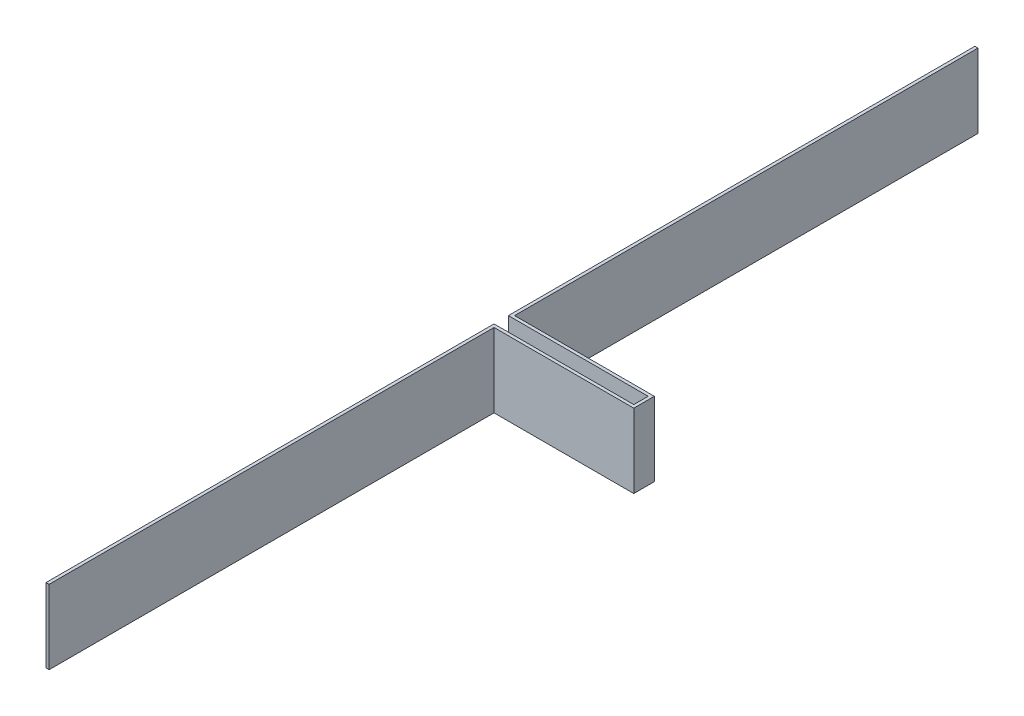
ISO-10303-21;
HEADER;
FILE_DESCRIPTION(('STEP AP214'),'2;1');
FILE_NAME('part.step','',(''),(''),'','','');
FILE_SCHEMA(('AUTOMOTIVE_DESIGN { 1 0 10303 214 1 1 1 1 }'));
ENDSEC;
DATA;
#1=APPLICATION_CONTEXT('core data for automotive mechanical design processes');
#2=APPLICATION_PROTOCOL_DEFINITION('international standard','automotive_design',2000,#1);
#3=PRODUCT_CONTEXT('',#1,'mechanical');
#4=PRODUCT('Part','Part','',(#3));
#5=PRODUCT_RELATED_PRODUCT_CATEGORY('part','',(#4));
#6=PRODUCT_DEFINITION_FORMATION('','',#4);
#7=PRODUCT_DEFINITION_CONTEXT('part definition',#1,'design');
#8=PRODUCT_DEFINITION('design','',#6,#7);
#9=PRODUCT_DEFINITION_SHAPE('','',#8);
#10=(LENGTH_UNIT() NAMED_UNIT(*) SI_UNIT(.MILLI.,.METRE.));
#11=(NAMED_UNIT(*) PLANE_ANGLE_UNIT() SI_UNIT($,.RADIAN.));
#12=(NAMED_UNIT(*) SI_UNIT($,.STERADIAN.) SOLID_ANGLE_UNIT());
#13=UNCERTAINTY_MEASURE_WITH_UNIT(LENGTH_MEASURE(1.E-05),#10,'distance_accuracy_value','');
#14=(GEOMETRIC_REPRESENTATION_CONTEXT(3) GLOBAL_UNCERTAINTY_ASSIGNED_CONTEXT((#13)) GLOBAL_UNIT_ASSIGNED_CONTEXT((#10,
#11,#12)) REPRESENTATION_CONTEXT('',''));
#15=CARTESIAN_POINT('',(0.,0.,0.));
#16=DIRECTION('',(0.,0.,1.));
#17=DIRECTION('',(1.,0.,0.));
#18=AXIS2_PLACEMENT_3D('',#15,#16,#17);
#19=CARTESIAN_POINT('',(19.05,457.200000000001,0.));
#20=DIRECTION('',(0.,0.,-1.00000000000001));
#21=DIRECTION('',(-1.,0.,0.));
#22=AXIS2_PLACEMENT_3D('',#19,#20,#21);
#23=PLANE('',#22);
#24=DIRECTION('',(1.,0.,0.));
#25=VECTOR('',#24,1.);
#26=CARTESIAN_POINT('',(19.05,0.,0.));
#27=LINE('',#26,#25);
#28=CARTESIAN_POINT('',(0.,0.,0.));
#29=VERTEX_POINT('',#28);
#30=CARTESIAN_POINT('',(19.05,0.,0.));
#31=VERTEX_POINT('',#30);
#32=EDGE_CURVE('E169',#29,#31,#27,.T.);
#33=ORIENTED_EDGE('',*,*,#32,.T.);
#34=DIRECTION('',(0.,-1.,0.));
#35=VECTOR('',#34,1.);
#36=CARTESIAN_POINT('',(19.05,457.200000000001,0.));
#37=LINE('',#36,#35);
#38=CARTESIAN_POINT('',(19.05,457.200000000001,0.));
#39=VERTEX_POINT('',#38);
#40=EDGE_CURVE('E11',#39,#31,#37,.T.);
#41=ORIENTED_EDGE('',*,*,#40,.F.);
#42=DIRECTION('',(1.,0.,0.));
#43=VECTOR('',#42,1.);
#44=CARTESIAN_POINT('',(19.05,457.200000000001,0.));
#45=LINE('',#44,#43);
#46=CARTESIAN_POINT('',(0.,457.200000000001,0.));
#47=VERTEX_POINT('',#46);
#48=EDGE_CURVE('E203',#47,#39,#45,.T.);
#49=ORIENTED_EDGE('',*,*,#48,.F.);
#50=DIRECTION('',(0.,-1.,0.));
#51=VECTOR('',#50,1.);
#52=CARTESIAN_POINT('',(0.,457.200000000001,0.));
#53=LINE('',#52,#51);
#54=EDGE_CURVE('E165',#47,#29,#53,.T.);
#55=ORIENTED_EDGE('',*,*,#54,.T.);
#56=EDGE_LOOP('',(#33,#41,#49,#55));
#57=FACE_BOUND('',#56,.T.);
#58=ADVANCED_FACE('F43',(#57),#23,.F.);
#59=CARTESIAN_POINT('',(19.0500000000002,457.200000000012,-2749.55000000002));
#60=DIRECTION('',(-1.,0.,0.));
#61=DIRECTION('',(0.,0.,1.00000000000001));
#62=AXIS2_PLACEMENT_3D('',#59,#60,#61);
#63=PLANE('',#62);
#64=DIRECTION('',(0.,0.,-1.00000000000001));
#65=VECTOR('',#64,1.);
#66=CARTESIAN_POINT('',(19.0500000000007,1.11022302462516E-11,-2749.55000000002));
#67=LINE('',#66,#65);
#68=CARTESIAN_POINT('',(19.0500000000007,1.11022302462516E-11,-2749.55000000002));
#69=VERTEX_POINT('',#68);
#70=EDGE_CURVE('E173',#31,#69,#67,.T.);
#71=ORIENTED_EDGE('',*,*,#70,.T.);
#72=DIRECTION('',(0.,-1.,0.));
#73=VECTOR('',#72,1.);
#74=CARTESIAN_POINT('',(19.0500000000002,457.200000000012,-2749.55000000002));
#75=LINE('',#74,#73);
#76=CARTESIAN_POINT('',(19.0500000000002,457.200000000012,-2749.55000000002));
#77=VERTEX_POINT('',#76);
#78=EDGE_CURVE('E52',#77,#69,#75,.T.);
#79=ORIENTED_EDGE('',*,*,#78,.F.);
#80=DIRECTION('',(0.,0.,-1.00000000000001));
#81=VECTOR('',#80,1.);
#82=CARTESIAN_POINT('',(19.0500000000002,457.200000000012,-2749.55000000002));
#83=LINE('',#82,#81);
#84=EDGE_CURVE('E115',#39,#77,#83,.T.);
#85=ORIENTED_EDGE('',*,*,#84,.F.);
#86=ORIENTED_EDGE('',*,*,#40,.T.);
#87=EDGE_LOOP('',(#71,#79,#85,#86));
#88=FACE_BOUND('',#87,.T.);
#89=ADVANCED_FACE('F325',(#88),#63,.F.);
#90=CARTESIAN_POINT('',(882.649999999999,457.200000000012,-2749.55000000002));
#91=DIRECTION('',(0.,0.,-1.00000000000001));
#92=DIRECTION('',(-1.,0.,0.));
#93=AXIS2_PLACEMENT_3D('',#90,#91,#92);
#94=PLANE('',#93);
#95=DIRECTION('',(1.,0.,0.));
#96=VECTOR('',#95,1.);
#97=CARTESIAN_POINT('',(882.649999999997,1.11022302462516E-11,-2749.55000000002));
#98=LINE('',#97,#96);
#99=CARTESIAN_POINT('',(882.649999999997,1.11022302462516E-11,-2749.55000000002));
#100=VERTEX_POINT('',#99);
#101=EDGE_CURVE('E176',#69,#100,#98,.T.);
#102=ORIENTED_EDGE('',*,*,#101,.T.);
#103=DIRECTION('',(0.,-1.,0.));
#104=VECTOR('',#103,1.);
#105=CARTESIAN_POINT('',(882.649999999999,457.200000000012,-2749.55000000002));
#106=LINE('',#105,#104);
#107=CARTESIAN_POINT('',(882.649999999999,457.200000000012,-2749.55000000002));
#108=VERTEX_POINT('',#107);
#109=EDGE_CURVE('E230',#108,#100,#106,.T.);
#110=ORIENTED_EDGE('',*,*,#109,.F.);
#111=DIRECTION('',(1.,0.,0.));
#112=VECTOR('',#111,1.);
#113=CARTESIAN_POINT('',(882.649999999999,457.200000000012,-2749.55000000002));
#114=LINE('',#113,#112);
#115=EDGE_CURVE('E241',#77,#108,#114,.T.);
#116=ORIENTED_EDGE('',*,*,#115,.F.);
#117=ORIENTED_EDGE('',*,*,#78,.T.);
#118=EDGE_LOOP('',(#102,#110,#116,#117));
#119=FACE_BOUND('',#118,.T.);
#120=ADVANCED_FACE('F239',(#119),#94,.F.);
#121=CARTESIAN_POINT('',(882.649999999997,457.200000000014,-2876.55000000002));
#122=DIRECTION('',(-1.,0.,0.));
#123=DIRECTION('',(0.,0.,1.00000000000001));
#124=AXIS2_PLACEMENT_3D('',#121,#122,#123);
#125=PLANE('',#124);
#126=DIRECTION('',(0.,0.,-1.00000000000001));
#127=VECTOR('',#126,1.);
#128=CARTESIAN_POINT('',(882.649999999997,1.11022302462516E-11,-2876.55000000002));
#129=LINE('',#128,#127);
#130=CARTESIAN_POINT('',(882.649999999997,1.11022302462516E-11,-2876.55000000002));
#131=VERTEX_POINT('',#130);
#132=EDGE_CURVE('E179',#100,#131,#129,.T.);
#133=ORIENTED_EDGE('',*,*,#132,.T.);
#134=DIRECTION('',(0.,-1.,0.));
#135=VECTOR('',#134,1.);
#136=CARTESIAN_POINT('',(882.649999999997,457.200000000014,-2876.55000000002));
#137=LINE('',#136,#135);
#138=CARTESIAN_POINT('',(882.649999999997,457.200000000014,-2876.55000000002));
#139=VERTEX_POINT('',#138);
#140=EDGE_CURVE('E226',#139,#131,#137,.T.);
#141=ORIENTED_EDGE('',*,*,#140,.F.);
#142=DIRECTION('',(0.,0.,-1.00000000000001));
#143=VECTOR('',#142,1.);
#144=CARTESIAN_POINT('',(882.649999999997,457.200000000014,-2876.55000000002));
#145=LINE('',#144,#143);
#146=EDGE_CURVE('E260',#108,#139,#145,.T.);
#147=ORIENTED_EDGE('',*,*,#146,.F.);
#148=ORIENTED_EDGE('',*,*,#109,.T.);
#149=EDGE_LOOP('',(#133,#141,#147,#148));
#150=FACE_BOUND('',#149,.T.);
#151=ADVANCED_FACE('F250',(#150),#125,.F.);
#152=CARTESIAN_POINT('',(19.0500000000007,457.200000000014,-2876.55000000002));
#153=DIRECTION('',(0.,0.,1.00000000000001));
#154=DIRECTION('',(1.,0.,0.));
#155=AXIS2_PLACEMENT_3D('',#152,#153,#154);
#156=PLANE('',#155);
#157=DIRECTION('',(-1.,0.,0.));
#158=VECTOR('',#157,1.);
#159=CARTESIAN_POINT('',(19.0500000000007,1.33226762955019E-11,-2876.55000000002));
#160=LINE('',#159,#158);
#161=CARTESIAN_POINT('',(19.0500000000007,1.33226762955019E-11,-2876.55000000002));
#162=VERTEX_POINT('',#161);
#163=EDGE_CURVE('E182',#131,#162,#160,.T.);
#164=ORIENTED_EDGE('',*,*,#163,.T.);
#165=DIRECTION('',(0.,-1.,0.));
#166=VECTOR('',#165,1.);
#167=CARTESIAN_POINT('',(19.0500000000007,457.200000000014,-2876.55000000002));
#168=LINE('',#167,#166);
#169=CARTESIAN_POINT('',(19.0500000000007,457.200000000014,-2876.55000000002));
#170=VERTEX_POINT('',#169);
#171=EDGE_CURVE('E222',#170,#162,#168,.T.);
#172=ORIENTED_EDGE('',*,*,#171,.F.);
#173=DIRECTION('',(-1.,0.,0.));
#174=VECTOR('',#173,1.);
#175=CARTESIAN_POINT('',(19.0500000000007,457.200000000014,-2876.55000000002));
#176=LINE('',#175,#174);
#177=EDGE_CURVE('E256',#139,#170,#176,.T.);
#178=ORIENTED_EDGE('',*,*,#177,.F.);
#179=ORIENTED_EDGE('',*,*,#140,.T.);
#180=EDGE_LOOP('',(#164,#172,#178,#179));
#181=FACE_BOUND('',#180,.T.);
#182=ADVANCED_FACE('F254',(#181),#156,.F.);
#183=CARTESIAN_POINT('',(19.0499999999973,457.200000000026,-5740.40000000004));
#184=DIRECTION('',(-1.,0.,0.));
#185=DIRECTION('',(0.,0.,1.00000000000001));
#186=AXIS2_PLACEMENT_3D('',#183,#184,#185);
#187=PLANE('',#186);
#188=DIRECTION('',(0.,0.,-1.00000000000001));
#189=VECTOR('',#188,1.);
#190=CARTESIAN_POINT('',(19.0499999999973,2.44249065417534E-11,-5740.40000000004));
#191=LINE('',#190,#189);
#192=CARTESIAN_POINT('',(19.0499999999973,2.44249065417534E-11,-5740.40000000004));
#193=VERTEX_POINT('',#192);
#194=EDGE_CURVE('E185',#162,#193,#191,.T.);
#195=ORIENTED_EDGE('',*,*,#194,.T.);
#196=DIRECTION('',(0.,-1.,0.));
#197=VECTOR('',#196,1.);
#198=CARTESIAN_POINT('',(19.0499999999973,457.200000000026,-5740.40000000004));
#199=LINE('',#198,#197);
#200=CARTESIAN_POINT('',(19.0499999999973,457.200000000026,-5740.40000000004));
#201=VERTEX_POINT('',#200);
#202=EDGE_CURVE('E218',#201,#193,#199,.T.);
#203=ORIENTED_EDGE('',*,*,#202,.F.);
#204=DIRECTION('',(0.,0.,-1.00000000000001));
#205=VECTOR('',#204,1.);
#206=CARTESIAN_POINT('',(19.0499999999973,457.200000000026,-5740.40000000004));
#207=LINE('',#206,#205);
#208=EDGE_CURVE('E259',#170,#201,#207,.T.);
#209=ORIENTED_EDGE('',*,*,#208,.F.);
#210=ORIENTED_EDGE('',*,*,#171,.T.);
#211=EDGE_LOOP('',(#195,#203,#209,#210));
#212=FACE_BOUND('',#211,.T.);
#213=ADVANCED_FACE('F337',(#212),#187,.F.);
#214=CARTESIAN_POINT('',(-2.66453525910038E-12,457.200000000026,-5740.40000000004));
#215=DIRECTION('',(0.,0.,1.00000000000001));
#216=DIRECTION('',(1.,0.,0.));
#217=AXIS2_PLACEMENT_3D('',#214,#215,#216);
#218=PLANE('',#217);
#219=DIRECTION('',(-1.,0.,0.));
#220=VECTOR('',#219,1.);
#221=CARTESIAN_POINT('',(-2.66453525910038E-12,2.44249065417534E-11,-5740.40000000004));
#222=LINE('',#221,#220);
#223=CARTESIAN_POINT('',(-2.66453525910038E-12,2.44249065417534E-11,-5740.40000000004));
#224=VERTEX_POINT('',#223);
#225=EDGE_CURVE('E188',#193,#224,#222,.T.);
#226=ORIENTED_EDGE('',*,*,#225,.T.);
#227=DIRECTION('',(0.,-1.,0.));
#228=VECTOR('',#227,1.);
#229=CARTESIAN_POINT('',(-2.66453525910038E-12,457.200000000026,-5740.40000000004));
#230=LINE('',#229,#228);
#231=CARTESIAN_POINT('',(-2.66453525910038E-12,457.200000000026,-5740.40000000004));
#232=VERTEX_POINT('',#231);
#233=EDGE_CURVE('E214',#232,#224,#230,.T.);
#234=ORIENTED_EDGE('',*,*,#233,.F.);
#235=DIRECTION('',(-1.,0.,0.));
#236=VECTOR('',#235,1.);
#237=CARTESIAN_POINT('',(-2.66453525910038E-12,457.200000000026,-5740.40000000004));
#238=LINE('',#237,#236);
#239=EDGE_CURVE('E265',#201,#232,#238,.T.);
#240=ORIENTED_EDGE('',*,*,#239,.F.);
#241=ORIENTED_EDGE('',*,*,#202,.T.);
#242=EDGE_LOOP('',(#226,#234,#240,#241));
#243=FACE_BOUND('',#242,.T.);
#244=ADVANCED_FACE('F340',(#243),#218,.F.);
#245=CARTESIAN_POINT('',(0.,457.200000000014,-2857.50000000002));
#246=DIRECTION('',(1.,0.,0.));
#247=DIRECTION('',(0.,0.,-1.00000000000001));
#248=AXIS2_PLACEMENT_3D('',#245,#246,#247);
#249=PLANE('',#248);
#250=DIRECTION('',(0.,0.,1.00000000000001));
#251=VECTOR('',#250,1.);
#252=CARTESIAN_POINT('',(0.,1.33226762955019E-11,-2857.50000000002));
#253=LINE('',#252,#251);
#254=CARTESIAN_POINT('',(0.,1.33226762955019E-11,-2857.50000000002));
#255=VERTEX_POINT('',#254);
#256=EDGE_CURVE('E191',#224,#255,#253,.T.);
#257=ORIENTED_EDGE('',*,*,#256,.T.);
#258=DIRECTION('',(0.,-1.,0.));
#259=VECTOR('',#258,1.);
#260=CARTESIAN_POINT('',(0.,457.200000000014,-2857.50000000002));
#261=LINE('',#260,#259);
#262=CARTESIAN_POINT('',(0.,457.200000000014,-2857.50000000002));
#263=VERTEX_POINT('',#262);
#264=EDGE_CURVE('E210',#263,#255,#261,.T.);
#265=ORIENTED_EDGE('',*,*,#264,.F.);
#266=DIRECTION('',(0.,0.,1.00000000000001));
#267=VECTOR('',#266,1.);
#268=CARTESIAN_POINT('',(0.,457.200000000014,-2857.50000000002));
#269=LINE('',#268,#267);
#270=EDGE_CURVE('E272',#232,#263,#269,.T.);
#271=ORIENTED_EDGE('',*,*,#270,.F.);
#272=ORIENTED_EDGE('',*,*,#233,.T.);
#273=EDGE_LOOP('',(#257,#265,#271,#272));
#274=FACE_BOUND('',#273,.T.);
#275=ADVANCED_FACE('F344',(#274),#249,.F.);
#276=CARTESIAN_POINT('',(863.599999999997,457.200000000013,-2857.50000000002));
#277=DIRECTION('',(0.,0.,-1.00000000000001));
#278=DIRECTION('',(-1.,0.,0.));
#279=AXIS2_PLACEMENT_3D('',#276,#277,#278);
#280=PLANE('',#279);
#281=DIRECTION('',(1.,0.,0.));
#282=VECTOR('',#281,1.);
#283=CARTESIAN_POINT('',(863.599999999997,1.11022302462516E-11,-2857.50000000002));
#284=LINE('',#283,#282);
#285=CARTESIAN_POINT('',(863.599999999997,1.11022302462516E-11,-2857.50000000002));
#286=VERTEX_POINT('',#285);
#287=EDGE_CURVE('E194',#255,#286,#284,.T.);
#288=ORIENTED_EDGE('',*,*,#287,.T.);
#289=DIRECTION('',(0.,-1.,0.));
#290=VECTOR('',#289,1.);
#291=CARTESIAN_POINT('',(863.599999999997,457.200000000013,-2857.50000000002));
#292=LINE('',#291,#290);
#293=CARTESIAN_POINT('',(863.599999999997,457.200000000013,-2857.50000000002));
#294=VERTEX_POINT('',#293);
#295=EDGE_CURVE('E157',#294,#286,#292,.T.);
#296=ORIENTED_EDGE('',*,*,#295,.F.);
#297=DIRECTION('',(1.,0.,0.));
#298=VECTOR('',#297,1.);
#299=CARTESIAN_POINT('',(863.599999999997,457.200000000013,-2857.50000000002));
#300=LINE('',#299,#298);
#301=EDGE_CURVE('E146',#263,#294,#300,.T.);
#302=ORIENTED_EDGE('',*,*,#301,.F.);
#303=ORIENTED_EDGE('',*,*,#264,.T.);
#304=EDGE_LOOP('',(#288,#296,#302,#303));
#305=FACE_BOUND('',#304,.T.);
#306=ADVANCED_FACE('F348',(#305),#280,.F.);
#307=CARTESIAN_POINT('',(863.599999999998,457.200000000011,-2768.60000000002));
#308=DIRECTION('',(1.,0.,0.));
#309=DIRECTION('',(0.,0.,-1.00000000000001));
#310=AXIS2_PLACEMENT_3D('',#307,#308,#309);
#311=PLANE('',#310);
#312=DIRECTION('',(0.,0.,1.00000000000001));
#313=VECTOR('',#312,1.);
#314=CARTESIAN_POINT('',(863.599999999997,1.11022302462516E-11,-2768.60000000002));
#315=LINE('',#314,#313);
#316=CARTESIAN_POINT('',(863.599999999997,1.11022302462516E-11,-2768.60000000002));
#317=VERTEX_POINT('',#316);
#318=EDGE_CURVE('E155',#286,#317,#315,.T.);
#319=ORIENTED_EDGE('',*,*,#318,.T.);
#320=DIRECTION('',(0.,-1.,0.));
#321=VECTOR('',#320,1.);
#322=CARTESIAN_POINT('',(863.599999999998,457.200000000011,-2768.60000000002));
#323=LINE('',#322,#321);
#324=CARTESIAN_POINT('',(863.599999999998,457.200000000011,-2768.60000000002));
#325=VERTEX_POINT('',#324);
#326=EDGE_CURVE('E152',#325,#317,#323,.T.);
#327=ORIENTED_EDGE('',*,*,#326,.F.);
#328=DIRECTION('',(0.,0.,1.00000000000001));
#329=VECTOR('',#328,1.);
#330=CARTESIAN_POINT('',(863.599999999998,457.200000000011,-2768.60000000002));
#331=LINE('',#330,#329);
#332=EDGE_CURVE('E140',#294,#325,#331,.T.);
#333=ORIENTED_EDGE('',*,*,#332,.F.);
#334=ORIENTED_EDGE('',*,*,#295,.T.);
#335=EDGE_LOOP('',(#319,#327,#333,#334));
#336=FACE_BOUND('',#335,.T.);
#337=ADVANCED_FACE('F153',(#336),#311,.F.);
#338=CARTESIAN_POINT('',(4.44089209850063E-13,457.200000000012,-2768.60000000002));
#339=DIRECTION('',(0.,0.,1.00000000000001));
#340=DIRECTION('',(1.,0.,0.));
#341=AXIS2_PLACEMENT_3D('',#338,#339,#340);
#342=PLANE('',#341);
#343=DIRECTION('',(-1.,0.,0.));
#344=VECTOR('',#343,1.);
#345=CARTESIAN_POINT('',(0.,1.33226762955019E-11,-2768.60000000002));
#346=LINE('',#345,#344);
#347=CARTESIAN_POINT('',(0.,1.33226762955019E-11,-2768.60000000002));
#348=VERTEX_POINT('',#347);
#349=EDGE_CURVE('E101',#317,#348,#346,.T.);
#350=ORIENTED_EDGE('',*,*,#349,.T.);
#351=DIRECTION('',(0.,-1.,0.));
#352=VECTOR('',#351,1.);
#353=CARTESIAN_POINT('',(4.44089209850063E-13,457.200000000012,-2768.60000000002));
#354=LINE('',#353,#352);
#355=CARTESIAN_POINT('',(4.44089209850063E-13,457.200000000012,-2768.60000000002));
#356=VERTEX_POINT('',#355);
#357=EDGE_CURVE('E158',#356,#348,#354,.T.);
#358=ORIENTED_EDGE('',*,*,#357,.F.);
#359=DIRECTION('',(-1.,0.,0.));
#360=VECTOR('',#359,1.);
#361=CARTESIAN_POINT('',(4.44089209850063E-13,457.200000000012,-2768.60000000002));
#362=LINE('',#361,#360);
#363=EDGE_CURVE('E144',#325,#356,#362,.T.);
#364=ORIENTED_EDGE('',*,*,#363,.F.);
#365=ORIENTED_EDGE('',*,*,#326,.T.);
#366=EDGE_LOOP('',(#350,#358,#364,#365));
#367=FACE_BOUND('',#366,.T.);
#368=ADVANCED_FACE('F160',(#367),#342,.F.);
#369=CARTESIAN_POINT('',(0.,457.200000000001,0.));
#370=DIRECTION('',(1.,0.,0.));
#371=DIRECTION('',(0.,0.,-1.00000000000001));
#372=AXIS2_PLACEMENT_3D('',#369,#370,#371);
#373=PLANE('',#372);
#374=DIRECTION('',(0.,0.,1.00000000000001));
#375=VECTOR('',#374,1.);
#376=CARTESIAN_POINT('',(0.,0.,0.));
#377=LINE('',#376,#375);
#378=EDGE_CURVE('E107',#348,#29,#377,.T.);
#379=ORIENTED_EDGE('',*,*,#378,.T.);
#380=ORIENTED_EDGE('',*,*,#54,.F.);
#381=DIRECTION('',(0.,0.,1.00000000000001));
#382=VECTOR('',#381,1.);
#383=CARTESIAN_POINT('',(0.,457.200000000001,0.));
#384=LINE('',#383,#382);
#385=EDGE_CURVE('E60',#356,#47,#384,.T.);
#386=ORIENTED_EDGE('',*,*,#385,.F.);
#387=ORIENTED_EDGE('',*,*,#357,.T.);
#388=EDGE_LOOP('',(#379,#380,#386,#387));
#389=FACE_BOUND('',#388,.T.);
#390=ADVANCED_FACE('F357',(#389),#373,.F.);
#391=CARTESIAN_POINT('',(0.,457.200000000001,0.));
#392=DIRECTION('',(0.,-1.,0.));
#393=DIRECTION('',(0.,0.,-1.00000000000001));
#394=AXIS2_PLACEMENT_3D('',#391,#392,#393);
#395=PLANE('',#394);
#396=ORIENTED_EDGE('',*,*,#48,.T.);
#397=ORIENTED_EDGE('',*,*,#84,.T.);
#398=ORIENTED_EDGE('',*,*,#115,.T.);
#399=ORIENTED_EDGE('',*,*,#146,.T.);
#400=ORIENTED_EDGE('',*,*,#177,.T.);
#401=ORIENTED_EDGE('',*,*,#208,.T.);
#402=ORIENTED_EDGE('',*,*,#239,.T.);
#403=ORIENTED_EDGE('',*,*,#270,.T.);
#404=ORIENTED_EDGE('',*,*,#301,.T.);
#405=ORIENTED_EDGE('',*,*,#332,.T.);
#406=ORIENTED_EDGE('',*,*,#363,.T.);
#407=ORIENTED_EDGE('',*,*,#385,.T.);
#408=EDGE_LOOP('',(#396,#397,#398,#399,#400,#401,#402,#403,#404,#405,#406,#407));
#409=FACE_BOUND('',#408,.T.);
#410=ADVANCED_FACE('F142',(#409),#395,.F.);
#411=CARTESIAN_POINT('',(0.,0.,0.));
#412=DIRECTION('',(0.,-1.,0.));
#413=DIRECTION('',(0.,0.,-1.00000000000001));
#414=AXIS2_PLACEMENT_3D('',#411,#412,#413);
#415=PLANE('',#414);
#416=ORIENTED_EDGE('',*,*,#32,.F.);
#417=ORIENTED_EDGE('',*,*,#378,.F.);
#418=ORIENTED_EDGE('',*,*,#349,.F.);
#419=ORIENTED_EDGE('',*,*,#318,.F.);
#420=ORIENTED_EDGE('',*,*,#287,.F.);
#421=ORIENTED_EDGE('',*,*,#256,.F.);
#422=ORIENTED_EDGE('',*,*,#225,.F.);
#423=ORIENTED_EDGE('',*,*,#194,.F.);
#424=ORIENTED_EDGE('',*,*,#163,.F.);
#425=ORIENTED_EDGE('',*,*,#132,.F.);
#426=ORIENTED_EDGE('',*,*,#101,.F.);
#427=ORIENTED_EDGE('',*,*,#70,.F.);
#428=EDGE_LOOP('',(#416,#417,#418,#419,#420,#421,#422,#423,#424,#425,#426,#427));
#429=FACE_BOUND('',#428,.T.);
#430=ADVANCED_FACE('F245',(#429),#415,.T.);
#431=CLOSED_SHELL('',(#58,#89,#120,#151,#182,#213,#244,#275,#306,#337,#368,#390,#410,#430));
#432=MANIFOLD_SOLID_BREP('B2',#431);
#433=ADVANCED_BREP_SHAPE_REPRESENTATION('',(#18,#432),#14);
#434=SHAPE_DEFINITION_REPRESENTATION(#9,#433);
ENDSEC;
END-ISO-10303-21;
